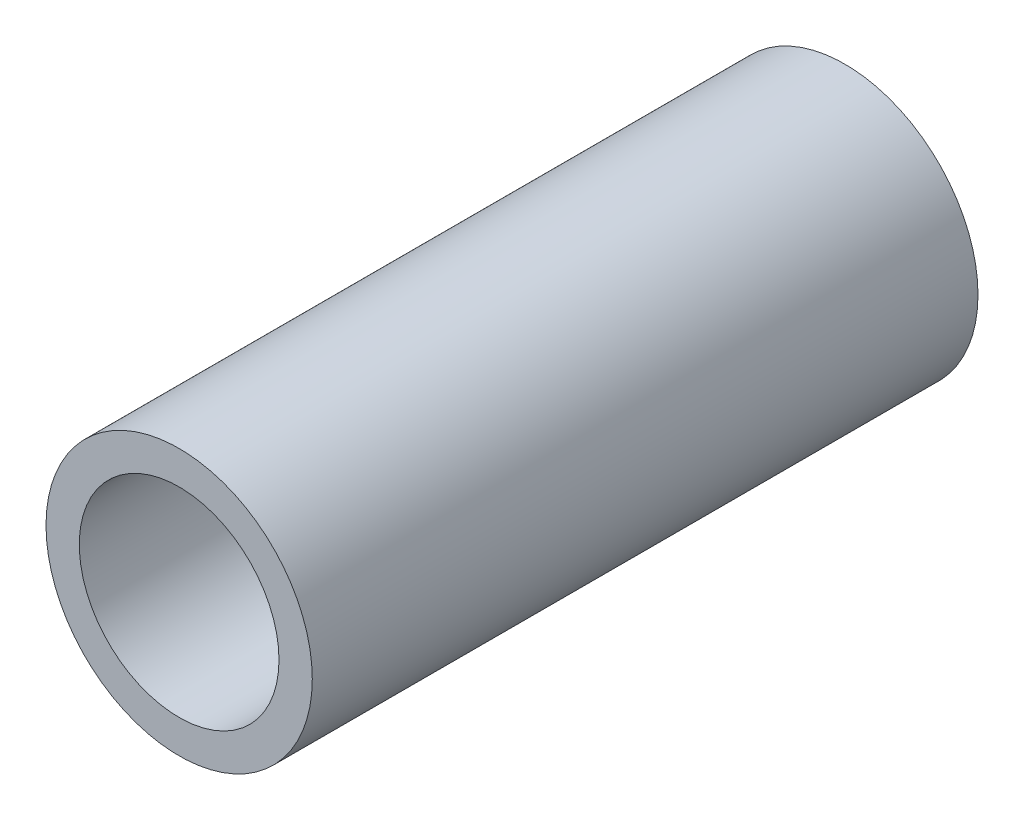
ISO-10303-21;
HEADER;
FILE_DESCRIPTION(('STEP AP214'),'2;1');
FILE_NAME('part.step','',(''),(''),'','','');
FILE_SCHEMA(('AUTOMOTIVE_DESIGN { 1 0 10303 214 1 1 1 1 }'));
ENDSEC;
DATA;
#1=APPLICATION_CONTEXT('core data for automotive mechanical design processes');
#2=APPLICATION_PROTOCOL_DEFINITION('international standard','automotive_design',2000,#1);
#3=PRODUCT_CONTEXT('',#1,'mechanical');
#4=PRODUCT('Part','Part','',(#3));
#5=PRODUCT_RELATED_PRODUCT_CATEGORY('part','',(#4));
#6=PRODUCT_DEFINITION_FORMATION('','',#4);
#7=PRODUCT_DEFINITION_CONTEXT('part definition',#1,'design');
#8=PRODUCT_DEFINITION('design','',#6,#7);
#9=PRODUCT_DEFINITION_SHAPE('','',#8);
#10=(LENGTH_UNIT() NAMED_UNIT(*) SI_UNIT(.MILLI.,.METRE.));
#11=(NAMED_UNIT(*) PLANE_ANGLE_UNIT() SI_UNIT($,.RADIAN.));
#12=(NAMED_UNIT(*) SI_UNIT($,.STERADIAN.) SOLID_ANGLE_UNIT());
#13=UNCERTAINTY_MEASURE_WITH_UNIT(LENGTH_MEASURE(1.E-05),#10,'distance_accuracy_value','');
#14=(GEOMETRIC_REPRESENTATION_CONTEXT(3) GLOBAL_UNCERTAINTY_ASSIGNED_CONTEXT((#13)) GLOBAL_UNIT_ASSIGNED_CONTEXT((#10,
#11,#12)) REPRESENTATION_CONTEXT('',''));
#15=CARTESIAN_POINT('',(0.,0.,0.));
#16=DIRECTION('',(0.,0.,1.));
#17=DIRECTION('',(1.,0.,0.));
#18=AXIS2_PLACEMENT_3D('',#15,#16,#17);
#19=CARTESIAN_POINT('',(0.,0.,31.75));
#20=DIRECTION('',(0.,0.,1.));
#21=DIRECTION('',(1.,0.,0.));
#22=AXIS2_PLACEMENT_3D('',#19,#20,#21);
#23=PLANE('',#22);
#24=CARTESIAN_POINT('',(0.,0.,31.75));
#25=DIRECTION('',(0.,0.,1.));
#26=DIRECTION('',(1.,0.,0.));
#27=AXIS2_PLACEMENT_3D('',#24,#25,#26);
#28=CIRCLE('',#27,12.7);
#29=CARTESIAN_POINT('',(12.7,0.,31.75));
#30=VERTEX_POINT('',#29);
#31=EDGE_CURVE('E11',#30,#30,#28,.T.);
#32=ORIENTED_EDGE('',*,*,#31,.T.);
#33=EDGE_LOOP('',(#32));
#34=FACE_BOUND('',#33,.T.);
#35=CARTESIAN_POINT('',(0.,0.,31.75));
#36=DIRECTION('',(0.,0.,1.));
#37=DIRECTION('',(1.,0.,0.));
#38=AXIS2_PLACEMENT_3D('',#35,#36,#37);
#39=CIRCLE('',#38,9.525);
#40=CARTESIAN_POINT('',(9.525,0.,31.75));
#41=VERTEX_POINT('',#40);
#42=EDGE_CURVE('E48',#41,#41,#39,.T.);
#43=ORIENTED_EDGE('',*,*,#42,.F.);
#44=EDGE_LOOP('',(#43));
#45=FACE_BOUND('',#44,.T.);
#46=ADVANCED_FACE('F37',(#34,#45),#23,.T.);
#47=CARTESIAN_POINT('',(0.,0.,-31.75));
#48=DIRECTION('',(0.,0.,1.));
#49=DIRECTION('',(1.,0.,0.));
#50=AXIS2_PLACEMENT_3D('',#47,#48,#49);
#51=PLANE('',#50);
#52=CARTESIAN_POINT('',(0.,0.,-31.75));
#53=DIRECTION('',(0.,0.,1.));
#54=DIRECTION('',(1.,0.,0.));
#55=AXIS2_PLACEMENT_3D('',#52,#53,#54);
#56=CIRCLE('',#55,12.7);
#57=CARTESIAN_POINT('',(12.7,0.,-31.75));
#58=VERTEX_POINT('',#57);
#59=EDGE_CURVE('E41',#58,#58,#56,.T.);
#60=ORIENTED_EDGE('',*,*,#59,.F.);
#61=EDGE_LOOP('',(#60));
#62=FACE_BOUND('',#61,.T.);
#63=CARTESIAN_POINT('',(0.,0.,-31.75));
#64=DIRECTION('',(0.,0.,1.));
#65=DIRECTION('',(1.,0.,0.));
#66=AXIS2_PLACEMENT_3D('',#63,#64,#65);
#67=CIRCLE('',#66,9.525);
#68=CARTESIAN_POINT('',(9.525,0.,-31.75));
#69=VERTEX_POINT('',#68);
#70=EDGE_CURVE('E50',#69,#69,#67,.T.);
#71=ORIENTED_EDGE('',*,*,#70,.T.);
#72=EDGE_LOOP('',(#71));
#73=FACE_BOUND('',#72,.T.);
#74=ADVANCED_FACE('F60',(#62,#73),#51,.F.);
#75=CARTESIAN_POINT('',(0.,0.,31.75));
#76=DIRECTION('',(0.,0.,-1.));
#77=DIRECTION('',(-1.,0.,0.));
#78=AXIS2_PLACEMENT_3D('',#75,#76,#77);
#79=CYLINDRICAL_SURFACE('',#78,12.7);
#80=ORIENTED_EDGE('',*,*,#31,.F.);
#81=EDGE_LOOP('',(#80));
#82=FACE_BOUND('',#81,.T.);
#83=ORIENTED_EDGE('',*,*,#59,.T.);
#84=EDGE_LOOP('',(#83));
#85=FACE_BOUND('',#84,.T.);
#86=ADVANCED_FACE('F39',(#82,#85),#79,.T.);
#87=CARTESIAN_POINT('',(0.,0.,31.75));
#88=DIRECTION('',(0.,0.,-1.));
#89=DIRECTION('',(-1.,0.,0.));
#90=AXIS2_PLACEMENT_3D('',#87,#88,#89);
#91=CYLINDRICAL_SURFACE('',#90,9.525);
#92=ORIENTED_EDGE('',*,*,#42,.T.);
#93=EDGE_LOOP('',(#92));
#94=FACE_BOUND('',#93,.T.);
#95=ORIENTED_EDGE('',*,*,#70,.F.);
#96=EDGE_LOOP('',(#95));
#97=FACE_BOUND('',#96,.T.);
#98=ADVANCED_FACE('F56',(#94,#97),#91,.F.);
#99=CLOSED_SHELL('',(#46,#74,#86,#98));
#100=MANIFOLD_SOLID_BREP('B2',#99);
#101=ADVANCED_BREP_SHAPE_REPRESENTATION('',(#18,#100),#14);
#102=SHAPE_DEFINITION_REPRESENTATION(#9,#101);
ENDSEC;
END-ISO-10303-21;
